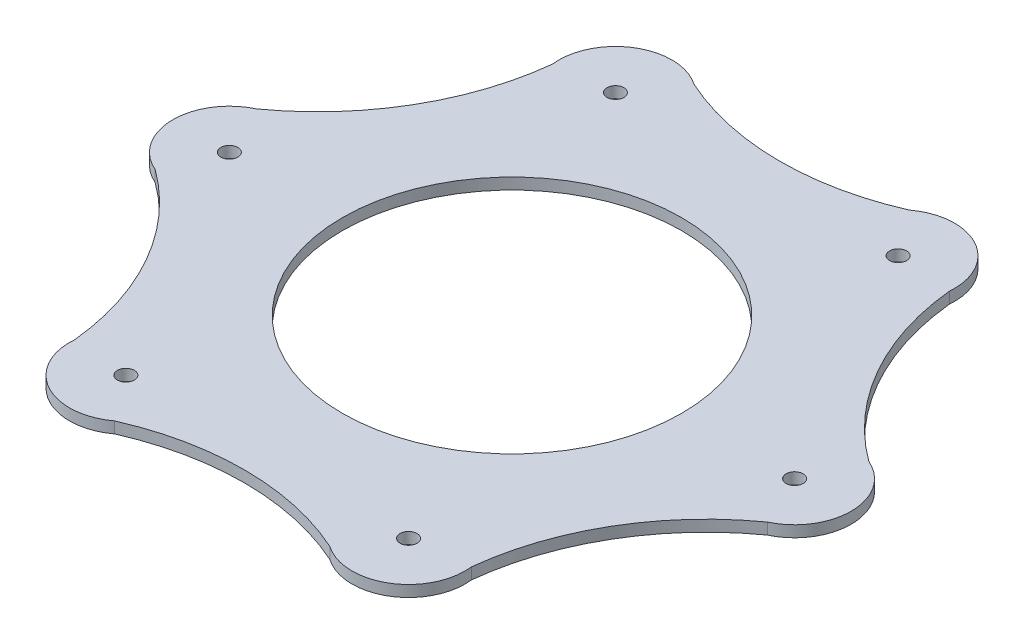
ISO-10303-21;
HEADER;
FILE_DESCRIPTION(('STEP AP214'),'2;1');
FILE_NAME('part.step','',(''),(''),'','','');
FILE_SCHEMA(('AUTOMOTIVE_DESIGN { 1 0 10303 214 1 1 1 1 }'));
ENDSEC;
DATA;
#1=APPLICATION_CONTEXT('core data for automotive mechanical design processes');
#2=APPLICATION_PROTOCOL_DEFINITION('international standard','automotive_design',2000,#1);
#3=PRODUCT_CONTEXT('',#1,'mechanical');
#4=PRODUCT('Part','Part','',(#3));
#5=PRODUCT_RELATED_PRODUCT_CATEGORY('part','',(#4));
#6=PRODUCT_DEFINITION_FORMATION('','',#4);
#7=PRODUCT_DEFINITION_CONTEXT('part definition',#1,'design');
#8=PRODUCT_DEFINITION('design','',#6,#7);
#9=PRODUCT_DEFINITION_SHAPE('','',#8);
#10=(LENGTH_UNIT() NAMED_UNIT(*) SI_UNIT(.MILLI.,.METRE.));
#11=(NAMED_UNIT(*) PLANE_ANGLE_UNIT() SI_UNIT($,.RADIAN.));
#12=(NAMED_UNIT(*) SI_UNIT($,.STERADIAN.) SOLID_ANGLE_UNIT());
#13=UNCERTAINTY_MEASURE_WITH_UNIT(LENGTH_MEASURE(1.E-05),#10,'distance_accuracy_value','');
#14=(GEOMETRIC_REPRESENTATION_CONTEXT(3) GLOBAL_UNCERTAINTY_ASSIGNED_CONTEXT((#13)) GLOBAL_UNIT_ASSIGNED_CONTEXT((#10,
#11,#12)) REPRESENTATION_CONTEXT('',''));
#15=CARTESIAN_POINT('',(0.,0.,0.));
#16=DIRECTION('',(0.,0.,1.));
#17=DIRECTION('',(1.,0.,0.));
#18=AXIS2_PLACEMENT_3D('',#15,#16,#17);
#19=CARTESIAN_POINT('',(-81.6104251950538,-1.99999999999999,47.0221208950114));
#20=DIRECTION('',(0.,1.,0.));
#21=DIRECTION('',(0.,0.,1.));
#22=AXIS2_PLACEMENT_3D('',#19,#20,#21);
#23=CYLINDRICAL_SURFACE('',#22,46.8718791369647);
#24=CARTESIAN_POINT('',(-81.6104251950538,0.,47.0221208950114));
#25=DIRECTION('',(0.,-1.,0.));
#26=DIRECTION('',(0.,0.,-1.));
#27=AXIS2_PLACEMENT_3D('',#24,#25,#26);
#28=CIRCLE('',#27,46.8718791369647);
#29=CARTESIAN_POINT('',(-53.9341237009031,0.,9.19362119656844));
#30=VERTEX_POINT('',#29);
#31=CARTESIAN_POINT('',(-34.9629411085947,0.,42.4411513214628));
#32=VERTEX_POINT('',#31);
#33=EDGE_CURVE('E166',#30,#32,#28,.T.);
#34=ORIENTED_EDGE('',*,*,#33,.F.);
#35=DIRECTION('',(0.,1.,0.));
#36=VECTOR('',#35,1.);
#37=CARTESIAN_POINT('',(-53.9341237009031,-1.99999999999999,9.19362119656844));
#38=LINE('',#37,#36);
#39=CARTESIAN_POINT('',(-53.9341237009031,-1.99999999999999,9.19362119656844));
#40=VERTEX_POINT('',#39);
#41=EDGE_CURVE('E11',#40,#30,#38,.T.);
#42=ORIENTED_EDGE('',*,*,#41,.F.);
#43=CARTESIAN_POINT('',(-81.6104251950538,-1.99999999999999,47.0221208950114));
#44=DIRECTION('',(0.,-1.,0.));
#45=DIRECTION('',(0.,0.,-1.));
#46=AXIS2_PLACEMENT_3D('',#43,#44,#45);
#47=CIRCLE('',#46,46.8718791369647);
#48=CARTESIAN_POINT('',(-34.9629411085947,-1.99999999999999,42.4411513214628));
#49=VERTEX_POINT('',#48);
#50=EDGE_CURVE('E211',#40,#49,#47,.T.);
#51=ORIENTED_EDGE('',*,*,#50,.T.);
#52=DIRECTION('',(0.,1.,0.));
#53=VECTOR('',#52,1.);
#54=CARTESIAN_POINT('',(-34.9629411085947,-1.99999999999999,42.4411513214628));
#55=LINE('',#54,#53);
#56=EDGE_CURVE('E42',#49,#32,#55,.T.);
#57=ORIENTED_EDGE('',*,*,#56,.T.);
#58=EDGE_LOOP('',(#34,#42,#51,#57));
#59=FACE_BOUND('',#58,.T.);
#60=ADVANCED_FACE('F39',(#59),#23,.F.);
#61=CARTESIAN_POINT('',(-50.,-1.99999999999999,0.));
#62=DIRECTION('',(0.,1.,0.));
#63=DIRECTION('',(0.,0.,1.));
#64=AXIS2_PLACEMENT_3D('',#61,#62,#63);
#65=CYLINDRICAL_SURFACE('',#64,10.);
#66=CARTESIAN_POINT('',(-50.,0.,0.));
#67=DIRECTION('',(0.,1.,0.));
#68=DIRECTION('',(0.,0.,1.));
#69=AXIS2_PLACEMENT_3D('',#66,#67,#68);
#70=CIRCLE('',#69,10.);
#71=CARTESIAN_POINT('',(-54.2365857645436,0.,-9.05821953033087));
#72=VERTEX_POINT('',#71);
#73=EDGE_CURVE('E208',#72,#30,#70,.T.);
#74=ORIENTED_EDGE('',*,*,#73,.F.);
#75=DIRECTION('',(0.,1.,0.));
#76=VECTOR('',#75,1.);
#77=CARTESIAN_POINT('',(-54.2365857645436,-1.99999999999999,-9.05821953033087));
#78=LINE('',#77,#76);
#79=CARTESIAN_POINT('',(-54.2365857645436,-1.99999999999999,-9.05821953033087));
#80=VERTEX_POINT('',#79);
#81=EDGE_CURVE('E49',#80,#72,#78,.T.);
#82=ORIENTED_EDGE('',*,*,#81,.F.);
#83=CARTESIAN_POINT('',(-50.,-1.99999999999999,0.));
#84=DIRECTION('',(0.,1.,0.));
#85=DIRECTION('',(0.,0.,1.));
#86=AXIS2_PLACEMENT_3D('',#83,#84,#85);
#87=CIRCLE('',#86,10.);
#88=EDGE_CURVE('E152',#80,#40,#87,.T.);
#89=ORIENTED_EDGE('',*,*,#88,.T.);
#90=ORIENTED_EDGE('',*,*,#41,.T.);
#91=EDGE_LOOP('',(#74,#82,#89,#90));
#92=FACE_BOUND('',#91,.T.);
#93=ADVANCED_FACE('F241',(#92),#65,.T.);
#94=CARTESIAN_POINT('',(-81.5275638324299,-1.99999999999999,-47.1656409850605));
#95=DIRECTION('',(0.,1.,0.));
#96=DIRECTION('',(0.,0.,1.));
#97=AXIS2_PLACEMENT_3D('',#94,#95,#96);
#98=CYLINDRICAL_SURFACE('',#97,46.8718791369648);
#99=CARTESIAN_POINT('',(-81.5275638324299,0.,-47.1656409850605));
#100=DIRECTION('',(0.,-1.,0.));
#101=DIRECTION('',(0.,0.,-1.));
#102=AXIS2_PLACEMENT_3D('',#99,#100,#101);
#103=CIRCLE('',#102,46.8718791369648);
#104=CARTESIAN_POINT('',(-34.9289713594509,0.,-42.1115106575502));
#105=VERTEX_POINT('',#104);
#106=EDGE_CURVE('E138',#105,#72,#103,.T.);
#107=ORIENTED_EDGE('',*,*,#106,.F.);
#108=DIRECTION('',(0.,1.,0.));
#109=VECTOR('',#108,1.);
#110=CARTESIAN_POINT('',(-34.9289713594509,-1.99999999999999,-42.1115106575502));
#111=LINE('',#110,#109);
#112=CARTESIAN_POINT('',(-34.9289713594509,-1.99999999999999,-42.1115106575502));
#113=VERTEX_POINT('',#112);
#114=EDGE_CURVE('E133',#113,#105,#111,.T.);
#115=ORIENTED_EDGE('',*,*,#114,.F.);
#116=CARTESIAN_POINT('',(-81.5275638324299,-1.99999999999999,-47.1656409850605));
#117=DIRECTION('',(0.,-1.,0.));
#118=DIRECTION('',(0.,0.,-1.));
#119=AXIS2_PLACEMENT_3D('',#116,#117,#118);
#120=CIRCLE('',#119,46.8718791369648);
#121=EDGE_CURVE('E136',#113,#80,#120,.T.);
#122=ORIENTED_EDGE('',*,*,#121,.T.);
#123=ORIENTED_EDGE('',*,*,#81,.T.);
#124=EDGE_LOOP('',(#107,#115,#122,#123));
#125=FACE_BOUND('',#124,.T.);
#126=ADVANCED_FACE('F135',(#125),#98,.F.);
#127=CARTESIAN_POINT('',(-25.,-1.99999999999999,-43.3012701892219));
#128=DIRECTION('',(0.,1.,0.));
#129=DIRECTION('',(0.,0.,1.));
#130=AXIS2_PLACEMENT_3D('',#127,#128,#129);
#131=CYLINDRICAL_SURFACE('',#130,10.);
#132=CARTESIAN_POINT('',(-25.,0.,-43.3012701892219));
#133=DIRECTION('',(0.,1.,0.));
#134=DIRECTION('',(0.,0.,1.));
#135=AXIS2_PLACEMENT_3D('',#132,#133,#134);
#136=CIRCLE('',#135,10.);
#137=CARTESIAN_POINT('',(-19.273644655949,0.,-51.4993708517937));
#138=VERTEX_POINT('',#137);
#139=EDGE_CURVE('E203',#138,#105,#136,.T.);
#140=ORIENTED_EDGE('',*,*,#139,.F.);
#141=DIRECTION('',(0.,1.,0.));
#142=VECTOR('',#141,1.);
#143=CARTESIAN_POINT('',(-19.273644655949,-1.99999999999999,-51.4993708517937));
#144=LINE('',#143,#142);
#145=CARTESIAN_POINT('',(-19.273644655949,-1.99999999999999,-51.4993708517937));
#146=VERTEX_POINT('',#145);
#147=EDGE_CURVE('E144',#146,#138,#144,.T.);
#148=ORIENTED_EDGE('',*,*,#147,.F.);
#149=CARTESIAN_POINT('',(-25.,-1.99999999999999,-43.3012701892219));
#150=DIRECTION('',(0.,1.,0.));
#151=DIRECTION('',(0.,0.,1.));
#152=AXIS2_PLACEMENT_3D('',#149,#150,#151);
#153=CIRCLE('',#152,10.);
#154=EDGE_CURVE('E150',#146,#113,#153,.T.);
#155=ORIENTED_EDGE('',*,*,#154,.T.);
#156=ORIENTED_EDGE('',*,*,#114,.T.);
#157=EDGE_LOOP('',(#140,#148,#155,#156));
#158=FACE_BOUND('',#157,.T.);
#159=ADVANCED_FACE('F155',(#158),#131,.T.);
#160=CARTESIAN_POINT('',(0.0828613626238912,-1.99999999999999,-94.1877618800719));
#161=DIRECTION('',(0.,1.,0.));
#162=DIRECTION('',(0.,0.,1.));
#163=AXIS2_PLACEMENT_3D('',#160,#161,#162);
#164=CYLINDRICAL_SURFACE('',#163,46.8718791369647);
#165=CARTESIAN_POINT('',(0.0828613626238912,0.,-94.1877618800719));
#166=DIRECTION('',(0.,-1.,0.));
#167=DIRECTION('',(0.,0.,-1.));
#168=AXIS2_PLACEMENT_3D('',#165,#166,#167);
#169=CIRCLE('',#168,46.8718791369647);
#170=CARTESIAN_POINT('',(19.0051523414522,0.,-51.3051318541187));
#171=VERTEX_POINT('',#170);
#172=EDGE_CURVE('E199',#171,#138,#169,.T.);
#173=ORIENTED_EDGE('',*,*,#172,.F.);
#174=DIRECTION('',(0.,1.,0.));
#175=VECTOR('',#174,1.);
#176=CARTESIAN_POINT('',(19.0051523414522,-1.99999999999999,-51.3051318541187));
#177=LINE('',#176,#175);
#178=CARTESIAN_POINT('',(19.0051523414522,-1.99999999999999,-51.3051318541187));
#179=VERTEX_POINT('',#178);
#180=EDGE_CURVE('E217',#179,#171,#177,.T.);
#181=ORIENTED_EDGE('',*,*,#180,.F.);
#182=CARTESIAN_POINT('',(0.0828613626238912,-1.99999999999999,-94.1877618800719));
#183=DIRECTION('',(0.,-1.,0.));
#184=DIRECTION('',(0.,0.,-1.));
#185=AXIS2_PLACEMENT_3D('',#182,#183,#184);
#186=CIRCLE('',#185,46.8718791369647);
#187=EDGE_CURVE('E157',#179,#146,#186,.T.);
#188=ORIENTED_EDGE('',*,*,#187,.T.);
#189=ORIENTED_EDGE('',*,*,#147,.T.);
#190=EDGE_LOOP('',(#173,#181,#188,#189));
#191=FACE_BOUND('',#190,.T.);
#192=ADVANCED_FACE('F254',(#191),#164,.F.);
#193=CARTESIAN_POINT('',(25.,-1.99999999999999,-43.3012701892219));
#194=DIRECTION('',(0.,1.,0.));
#195=DIRECTION('',(0.,0.,1.));
#196=AXIS2_PLACEMENT_3D('',#193,#194,#195);
#197=CYLINDRICAL_SURFACE('',#196,10.);
#198=CARTESIAN_POINT('',(25.,0.,-43.3012701892219));
#199=DIRECTION('',(0.,1.,0.));
#200=DIRECTION('',(0.,0.,1.));
#201=AXIS2_PLACEMENT_3D('',#198,#199,#200);
#202=CIRCLE('',#201,10.);
#203=CARTESIAN_POINT('',(34.9629411085947,0.,-42.4411513214628));
#204=VERTEX_POINT('',#203);
#205=EDGE_CURVE('E195',#204,#171,#202,.T.);
#206=ORIENTED_EDGE('',*,*,#205,.F.);
#207=DIRECTION('',(0.,1.,0.));
#208=VECTOR('',#207,1.);
#209=CARTESIAN_POINT('',(34.9629411085947,-1.99999999999999,-42.4411513214628));
#210=LINE('',#209,#208);
#211=CARTESIAN_POINT('',(34.9629411085947,-1.99999999999999,-42.4411513214628));
#212=VERTEX_POINT('',#211);
#213=EDGE_CURVE('E220',#212,#204,#210,.T.);
#214=ORIENTED_EDGE('',*,*,#213,.F.);
#215=CARTESIAN_POINT('',(25.,-1.99999999999999,-43.3012701892219));
#216=DIRECTION('',(0.,1.,0.));
#217=DIRECTION('',(0.,0.,1.));
#218=AXIS2_PLACEMENT_3D('',#215,#216,#217);
#219=CIRCLE('',#218,10.);
#220=EDGE_CURVE('E160',#212,#179,#219,.T.);
#221=ORIENTED_EDGE('',*,*,#220,.T.);
#222=ORIENTED_EDGE('',*,*,#180,.T.);
#223=EDGE_LOOP('',(#206,#214,#221,#222));
#224=FACE_BOUND('',#223,.T.);
#225=ADVANCED_FACE('F257',(#224),#197,.T.);
#226=CARTESIAN_POINT('',(81.6104251950538,-1.99999999999999,-47.0221208950115));
#227=DIRECTION('',(0.,1.,0.));
#228=DIRECTION('',(0.,0.,1.));
#229=AXIS2_PLACEMENT_3D('',#226,#227,#228);
#230=CYLINDRICAL_SURFACE('',#229,46.8718791369648);
#231=CARTESIAN_POINT('',(81.6104251950538,0.,-47.0221208950115));
#232=DIRECTION('',(0.,-1.,0.));
#233=DIRECTION('',(0.,0.,-1.));
#234=AXIS2_PLACEMENT_3D('',#231,#232,#233);
#235=CIRCLE('',#234,46.8718791369648);
#236=CARTESIAN_POINT('',(53.9341237009031,0.,-9.19362119656846));
#237=VERTEX_POINT('',#236);
#238=EDGE_CURVE('E191',#237,#204,#235,.T.);
#239=ORIENTED_EDGE('',*,*,#238,.F.);
#240=DIRECTION('',(0.,1.,0.));
#241=VECTOR('',#240,1.);
#242=CARTESIAN_POINT('',(53.9341237009031,-1.99999999999999,-9.19362119656846));
#243=LINE('',#242,#241);
#244=CARTESIAN_POINT('',(53.9341237009031,-1.99999999999999,-9.19362119656846));
#245=VERTEX_POINT('',#244);
#246=EDGE_CURVE('E223',#245,#237,#243,.T.);
#247=ORIENTED_EDGE('',*,*,#246,.F.);
#248=CARTESIAN_POINT('',(81.6104251950538,-1.99999999999999,-47.0221208950115));
#249=DIRECTION('',(0.,-1.,0.));
#250=DIRECTION('',(0.,0.,-1.));
#251=AXIS2_PLACEMENT_3D('',#248,#249,#250);
#252=CIRCLE('',#251,46.8718791369648);
#253=EDGE_CURVE('E401',#245,#212,#252,.T.);
#254=ORIENTED_EDGE('',*,*,#253,.T.);
#255=ORIENTED_EDGE('',*,*,#213,.T.);
#256=EDGE_LOOP('',(#239,#247,#254,#255));
#257=FACE_BOUND('',#256,.T.);
#258=ADVANCED_FACE('F261',(#257),#230,.F.);
#259=CARTESIAN_POINT('',(50.,-1.99999999999999,0.));
#260=DIRECTION('',(0.,1.,0.));
#261=DIRECTION('',(0.,0.,1.));
#262=AXIS2_PLACEMENT_3D('',#259,#260,#261);
#263=CYLINDRICAL_SURFACE('',#262,10.);
#264=CARTESIAN_POINT('',(50.,0.,0.));
#265=DIRECTION('',(0.,1.,0.));
#266=DIRECTION('',(0.,0.,1.));
#267=AXIS2_PLACEMENT_3D('',#264,#265,#266);
#268=CIRCLE('',#267,10.);
#269=CARTESIAN_POINT('',(54.2365857645437,0.,9.05821953033082));
#270=VERTEX_POINT('',#269);
#271=EDGE_CURVE('E187',#270,#237,#268,.T.);
#272=ORIENTED_EDGE('',*,*,#271,.F.);
#273=DIRECTION('',(0.,1.,0.));
#274=VECTOR('',#273,1.);
#275=CARTESIAN_POINT('',(54.2365857645437,-1.99999999999999,9.05821953033082));
#276=LINE('',#275,#274);
#277=CARTESIAN_POINT('',(54.2365857645437,-1.99999999999999,9.05821953033082));
#278=VERTEX_POINT('',#277);
#279=EDGE_CURVE('E226',#278,#270,#276,.T.);
#280=ORIENTED_EDGE('',*,*,#279,.F.);
#281=CARTESIAN_POINT('',(50.,-1.99999999999999,0.));
#282=DIRECTION('',(0.,1.,0.));
#283=DIRECTION('',(0.,0.,1.));
#284=AXIS2_PLACEMENT_3D('',#281,#282,#283);
#285=CIRCLE('',#284,10.);
#286=EDGE_CURVE('E397',#278,#245,#285,.T.);
#287=ORIENTED_EDGE('',*,*,#286,.T.);
#288=ORIENTED_EDGE('',*,*,#246,.T.);
#289=EDGE_LOOP('',(#272,#280,#287,#288));
#290=FACE_BOUND('',#289,.T.);
#291=ADVANCED_FACE('F265',(#290),#263,.T.);
#292=CARTESIAN_POINT('',(81.5275638324299,-1.99999999999999,47.1656409850604));
#293=DIRECTION('',(0.,1.,0.));
#294=DIRECTION('',(0.,0.,1.));
#295=AXIS2_PLACEMENT_3D('',#292,#293,#294);
#296=CYLINDRICAL_SURFACE('',#295,46.8718791369648);
#297=CARTESIAN_POINT('',(81.5275638324299,0.,47.1656409850604));
#298=DIRECTION('',(0.,-1.,0.));
#299=DIRECTION('',(0.,0.,-1.));
#300=AXIS2_PLACEMENT_3D('',#297,#298,#299);
#301=CIRCLE('',#300,46.8718791369648);
#302=CARTESIAN_POINT('',(34.9289713594509,0.,42.1115106575502));
#303=VERTEX_POINT('',#302);
#304=EDGE_CURVE('E183',#303,#270,#301,.T.);
#305=ORIENTED_EDGE('',*,*,#304,.F.);
#306=DIRECTION('',(0.,1.,0.));
#307=VECTOR('',#306,1.);
#308=CARTESIAN_POINT('',(34.9289713594509,-1.99999999999999,42.1115106575502));
#309=LINE('',#308,#307);
#310=CARTESIAN_POINT('',(34.9289713594509,-1.99999999999999,42.1115106575502));
#311=VERTEX_POINT('',#310);
#312=EDGE_CURVE('E229',#311,#303,#309,.T.);
#313=ORIENTED_EDGE('',*,*,#312,.F.);
#314=CARTESIAN_POINT('',(81.5275638324299,-1.99999999999999,47.1656409850604));
#315=DIRECTION('',(0.,-1.,0.));
#316=DIRECTION('',(0.,0.,-1.));
#317=AXIS2_PLACEMENT_3D('',#314,#315,#316);
#318=CIRCLE('',#317,46.8718791369648);
#319=EDGE_CURVE('E393',#311,#278,#318,.T.);
#320=ORIENTED_EDGE('',*,*,#319,.T.);
#321=ORIENTED_EDGE('',*,*,#279,.T.);
#322=EDGE_LOOP('',(#305,#313,#320,#321));
#323=FACE_BOUND('',#322,.T.);
#324=ADVANCED_FACE('F269',(#323),#296,.F.);
#325=CARTESIAN_POINT('',(25.,-1.99999999999999,43.301270189222));
#326=DIRECTION('',(0.,1.,0.));
#327=DIRECTION('',(0.,0.,1.));
#328=AXIS2_PLACEMENT_3D('',#325,#326,#327);
#329=CYLINDRICAL_SURFACE('',#328,10.);
#330=CARTESIAN_POINT('',(25.,0.,43.301270189222));
#331=DIRECTION('',(0.,1.,0.));
#332=DIRECTION('',(0.,0.,1.));
#333=AXIS2_PLACEMENT_3D('',#330,#331,#332);
#334=CIRCLE('',#333,10.);
#335=CARTESIAN_POINT('',(19.273644655949,0.,51.4993708517937));
#336=VERTEX_POINT('',#335);
#337=EDGE_CURVE('E179',#336,#303,#334,.T.);
#338=ORIENTED_EDGE('',*,*,#337,.F.);
#339=DIRECTION('',(0.,1.,0.));
#340=VECTOR('',#339,1.);
#341=CARTESIAN_POINT('',(19.273644655949,-1.99999999999999,51.4993708517937));
#342=LINE('',#341,#340);
#343=CARTESIAN_POINT('',(19.273644655949,-1.99999999999999,51.4993708517937));
#344=VERTEX_POINT('',#343);
#345=EDGE_CURVE('E232',#344,#336,#342,.T.);
#346=ORIENTED_EDGE('',*,*,#345,.F.);
#347=CARTESIAN_POINT('',(25.,-1.99999999999999,43.301270189222));
#348=DIRECTION('',(0.,1.,0.));
#349=DIRECTION('',(0.,0.,1.));
#350=AXIS2_PLACEMENT_3D('',#347,#348,#349);
#351=CIRCLE('',#350,10.);
#352=EDGE_CURVE('E389',#344,#311,#351,.T.);
#353=ORIENTED_EDGE('',*,*,#352,.T.);
#354=ORIENTED_EDGE('',*,*,#312,.T.);
#355=EDGE_LOOP('',(#338,#346,#353,#354));
#356=FACE_BOUND('',#355,.T.);
#357=ADVANCED_FACE('F273',(#356),#329,.T.);
#358=CARTESIAN_POINT('',(-0.0828613626238797,-1.99999999999999,94.1877618800719));
#359=DIRECTION('',(0.,1.,0.));
#360=DIRECTION('',(0.,0.,1.));
#361=AXIS2_PLACEMENT_3D('',#358,#359,#360);
#362=CYLINDRICAL_SURFACE('',#361,46.8718791369647);
#363=CARTESIAN_POINT('',(-0.0828613626238797,0.,94.1877618800719));
#364=DIRECTION('',(0.,-1.,0.));
#365=DIRECTION('',(0.,0.,-1.));
#366=AXIS2_PLACEMENT_3D('',#363,#364,#365);
#367=CIRCLE('',#366,46.8718791369647);
#368=CARTESIAN_POINT('',(-19.0051523414522,0.,51.3051318541187));
#369=VERTEX_POINT('',#368);
#370=EDGE_CURVE('E175',#369,#336,#367,.T.);
#371=ORIENTED_EDGE('',*,*,#370,.F.);
#372=DIRECTION('',(0.,1.,0.));
#373=VECTOR('',#372,1.);
#374=CARTESIAN_POINT('',(-19.0051523414522,-1.99999999999999,51.3051318541187));
#375=LINE('',#374,#373);
#376=CARTESIAN_POINT('',(-19.0051523414522,-1.99999999999999,51.3051318541187));
#377=VERTEX_POINT('',#376);
#378=EDGE_CURVE('E234',#377,#369,#375,.T.);
#379=ORIENTED_EDGE('',*,*,#378,.F.);
#380=CARTESIAN_POINT('',(-0.0828613626238797,-1.99999999999999,94.1877618800719));
#381=DIRECTION('',(0.,-1.,0.));
#382=DIRECTION('',(0.,0.,-1.));
#383=AXIS2_PLACEMENT_3D('',#380,#381,#382);
#384=CIRCLE('',#383,46.8718791369647);
#385=EDGE_CURVE('E385',#377,#344,#384,.T.);
#386=ORIENTED_EDGE('',*,*,#385,.T.);
#387=ORIENTED_EDGE('',*,*,#345,.T.);
#388=EDGE_LOOP('',(#371,#379,#386,#387));
#389=FACE_BOUND('',#388,.T.);
#390=ADVANCED_FACE('F277',(#389),#362,.F.);
#391=CARTESIAN_POINT('',(-25.,-1.99999999999999,43.3012701892219));
#392=DIRECTION('',(0.,1.,0.));
#393=DIRECTION('',(0.,0.,1.));
#394=AXIS2_PLACEMENT_3D('',#391,#392,#393);
#395=CYLINDRICAL_SURFACE('',#394,10.);
#396=CARTESIAN_POINT('',(-25.,0.,43.3012701892219));
#397=DIRECTION('',(0.,1.,0.));
#398=DIRECTION('',(0.,0.,1.));
#399=AXIS2_PLACEMENT_3D('',#396,#397,#398);
#400=CIRCLE('',#399,10.);
#401=EDGE_CURVE('E170',#32,#369,#400,.T.);
#402=ORIENTED_EDGE('',*,*,#401,.F.);
#403=ORIENTED_EDGE('',*,*,#56,.F.);
#404=CARTESIAN_POINT('',(-25.,-1.99999999999999,43.3012701892219));
#405=DIRECTION('',(0.,1.,0.));
#406=DIRECTION('',(0.,0.,1.));
#407=AXIS2_PLACEMENT_3D('',#404,#405,#406);
#408=CIRCLE('',#407,10.);
#409=EDGE_CURVE('E382',#49,#377,#408,.T.);
#410=ORIENTED_EDGE('',*,*,#409,.T.);
#411=ORIENTED_EDGE('',*,*,#378,.T.);
#412=EDGE_LOOP('',(#402,#403,#410,#411));
#413=FACE_BOUND('',#412,.T.);
#414=ADVANCED_FACE('F238',(#413),#395,.T.);
#415=CARTESIAN_POINT('',(-53.3052125975269,-1.99999999999999,45.1616955421166));
#416=DIRECTION('',(0.,-1.,0.));
#417=DIRECTION('',(0.,0.,-1.));
#418=AXIS2_PLACEMENT_3D('',#415,#416,#417);
#419=PLANE('',#418);
#420=CARTESIAN_POINT('',(-25.,-1.99999999999999,-43.3012701892219));
#421=DIRECTION('',(0.,1.,0.));
#422=DIRECTION('',(0.,0.,-1.));
#423=AXIS2_PLACEMENT_3D('',#420,#421,#422);
#424=CIRCLE('',#423,1.5);
#425=CARTESIAN_POINT('',(-25.,-1.99999999999999,-44.8012701892219));
#426=VERTEX_POINT('',#425);
#427=EDGE_CURVE('E324',#426,#426,#424,.T.);
#428=ORIENTED_EDGE('',*,*,#427,.T.);
#429=EDGE_LOOP('',(#428));
#430=FACE_BOUND('',#429,.T.);
#431=CARTESIAN_POINT('',(-50.,-1.99999999999999,0.));
#432=DIRECTION('',(0.,1.,0.));
#433=DIRECTION('',(0.,0.,-1.));
#434=AXIS2_PLACEMENT_3D('',#431,#432,#433);
#435=CIRCLE('',#434,1.5);
#436=CARTESIAN_POINT('',(-50.,-1.99999999999999,-1.50000000000001));
#437=VERTEX_POINT('',#436);
#438=EDGE_CURVE('E334',#437,#437,#435,.T.);
#439=ORIENTED_EDGE('',*,*,#438,.T.);
#440=EDGE_LOOP('',(#439));
#441=FACE_BOUND('',#440,.T.);
#442=CARTESIAN_POINT('',(-25.,-1.99999999999999,43.3012701892219));
#443=DIRECTION('',(0.,1.,0.));
#444=DIRECTION('',(0.,0.,-1.));
#445=AXIS2_PLACEMENT_3D('',#442,#443,#444);
#446=CIRCLE('',#445,1.5);
#447=CARTESIAN_POINT('',(-25.,-1.99999999999999,41.8012701892219));
#448=VERTEX_POINT('',#447);
#449=EDGE_CURVE('E342',#448,#448,#446,.T.);
#450=ORIENTED_EDGE('',*,*,#449,.T.);
#451=EDGE_LOOP('',(#450));
#452=FACE_BOUND('',#451,.T.);
#453=CARTESIAN_POINT('',(25.,-1.99999999999999,-43.3012701892219));
#454=DIRECTION('',(0.,1.,0.));
#455=DIRECTION('',(0.,0.,-1.));
#456=AXIS2_PLACEMENT_3D('',#453,#454,#455);
#457=CIRCLE('',#456,1.5);
#458=CARTESIAN_POINT('',(25.,-1.99999999999999,-44.8012701892219));
#459=VERTEX_POINT('',#458);
#460=EDGE_CURVE('E350',#459,#459,#457,.T.);
#461=ORIENTED_EDGE('',*,*,#460,.T.);
#462=EDGE_LOOP('',(#461));
#463=FACE_BOUND('',#462,.T.);
#464=CARTESIAN_POINT('',(25.,-1.99999999999999,43.301270189222));
#465=DIRECTION('',(0.,1.,0.));
#466=DIRECTION('',(0.,0.,-1.));
#467=AXIS2_PLACEMENT_3D('',#464,#465,#466);
#468=CIRCLE('',#467,1.5);
#469=CARTESIAN_POINT('',(25.,-1.99999999999999,41.801270189222));
#470=VERTEX_POINT('',#469);
#471=EDGE_CURVE('E358',#470,#470,#468,.T.);
#472=ORIENTED_EDGE('',*,*,#471,.T.);
#473=EDGE_LOOP('',(#472));
#474=FACE_BOUND('',#473,.T.);
#475=CARTESIAN_POINT('',(50.,-1.99999999999999,0.));
#476=DIRECTION('',(0.,1.,0.));
#477=DIRECTION('',(0.,0.,-1.));
#478=AXIS2_PLACEMENT_3D('',#475,#476,#477);
#479=CIRCLE('',#478,1.5);
#480=CARTESIAN_POINT('',(50.,-1.99999999999999,-1.5));
#481=VERTEX_POINT('',#480);
#482=EDGE_CURVE('E366',#481,#481,#479,.T.);
#483=ORIENTED_EDGE('',*,*,#482,.T.);
#484=EDGE_LOOP('',(#483));
#485=FACE_BOUND('',#484,.T.);
#486=CARTESIAN_POINT('',(0.,-1.99999999999999,0.));
#487=DIRECTION('',(0.,1.,0.));
#488=DIRECTION('',(0.,0.,-1.));
#489=AXIS2_PLACEMENT_3D('',#486,#487,#488);
#490=CIRCLE('',#489,30.);
#491=CARTESIAN_POINT('',(0.,-1.99999999999999,-30.));
#492=VERTEX_POINT('',#491);
#493=EDGE_CURVE('E171',#492,#492,#490,.T.);
#494=ORIENTED_EDGE('',*,*,#493,.T.);
#495=EDGE_LOOP('',(#494));
#496=FACE_BOUND('',#495,.T.);
#497=ORIENTED_EDGE('',*,*,#50,.F.);
#498=ORIENTED_EDGE('',*,*,#88,.F.);
#499=ORIENTED_EDGE('',*,*,#121,.F.);
#500=ORIENTED_EDGE('',*,*,#154,.F.);
#501=ORIENTED_EDGE('',*,*,#187,.F.);
#502=ORIENTED_EDGE('',*,*,#220,.F.);
#503=ORIENTED_EDGE('',*,*,#253,.F.);
#504=ORIENTED_EDGE('',*,*,#286,.F.);
#505=ORIENTED_EDGE('',*,*,#319,.F.);
#506=ORIENTED_EDGE('',*,*,#352,.F.);
#507=ORIENTED_EDGE('',*,*,#385,.F.);
#508=ORIENTED_EDGE('',*,*,#409,.F.);
#509=EDGE_LOOP('',(#497,#498,#499,#500,#501,#502,#503,#504,#505,#506,#507,#508));
#510=FACE_BOUND('',#509,.T.);
#511=ADVANCED_FACE('F148',(#430,#441,#452,#463,#474,#485,#496,#510),#419,.T.);
#512=CARTESIAN_POINT('',(-53.3052125975269,0.,45.1616955421166));
#513=DIRECTION('',(0.,-1.,0.));
#514=DIRECTION('',(0.,0.,-1.));
#515=AXIS2_PLACEMENT_3D('',#512,#513,#514);
#516=PLANE('',#515);
#517=CARTESIAN_POINT('',(-25.,0.,-43.3012701892219));
#518=DIRECTION('',(0.,1.,0.));
#519=DIRECTION('',(0.,0.,-1.));
#520=AXIS2_PLACEMENT_3D('',#517,#518,#519);
#521=CIRCLE('',#520,1.5);
#522=CARTESIAN_POINT('',(-25.,0.,-44.8012701892219));
#523=VERTEX_POINT('',#522);
#524=EDGE_CURVE('E327',#523,#523,#521,.T.);
#525=ORIENTED_EDGE('',*,*,#524,.F.);
#526=EDGE_LOOP('',(#525));
#527=FACE_BOUND('',#526,.T.);
#528=CARTESIAN_POINT('',(-50.,0.,0.));
#529=DIRECTION('',(0.,1.,0.));
#530=DIRECTION('',(0.,0.,-1.));
#531=AXIS2_PLACEMENT_3D('',#528,#529,#530);
#532=CIRCLE('',#531,1.5);
#533=CARTESIAN_POINT('',(-50.,0.,-1.50000000000001));
#534=VERTEX_POINT('',#533);
#535=EDGE_CURVE('E331',#534,#534,#532,.T.);
#536=ORIENTED_EDGE('',*,*,#535,.F.);
#537=EDGE_LOOP('',(#536));
#538=FACE_BOUND('',#537,.T.);
#539=CARTESIAN_POINT('',(-25.,0.,43.3012701892219));
#540=DIRECTION('',(0.,1.,0.));
#541=DIRECTION('',(0.,0.,-1.));
#542=AXIS2_PLACEMENT_3D('',#539,#540,#541);
#543=CIRCLE('',#542,1.5);
#544=CARTESIAN_POINT('',(-25.,0.,41.8012701892219));
#545=VERTEX_POINT('',#544);
#546=EDGE_CURVE('E338',#545,#545,#543,.T.);
#547=ORIENTED_EDGE('',*,*,#546,.F.);
#548=EDGE_LOOP('',(#547));
#549=FACE_BOUND('',#548,.T.);
#550=CARTESIAN_POINT('',(25.,0.,-43.3012701892219));
#551=DIRECTION('',(0.,1.,0.));
#552=DIRECTION('',(0.,0.,-1.));
#553=AXIS2_PLACEMENT_3D('',#550,#551,#552);
#554=CIRCLE('',#553,1.5);
#555=CARTESIAN_POINT('',(25.,0.,-44.8012701892219));
#556=VERTEX_POINT('',#555);
#557=EDGE_CURVE('E346',#556,#556,#554,.T.);
#558=ORIENTED_EDGE('',*,*,#557,.F.);
#559=EDGE_LOOP('',(#558));
#560=FACE_BOUND('',#559,.T.);
#561=CARTESIAN_POINT('',(25.,0.,43.301270189222));
#562=DIRECTION('',(0.,1.,0.));
#563=DIRECTION('',(0.,0.,-1.));
#564=AXIS2_PLACEMENT_3D('',#561,#562,#563);
#565=CIRCLE('',#564,1.5);
#566=CARTESIAN_POINT('',(25.,0.,41.801270189222));
#567=VERTEX_POINT('',#566);
#568=EDGE_CURVE('E354',#567,#567,#565,.T.);
#569=ORIENTED_EDGE('',*,*,#568,.F.);
#570=EDGE_LOOP('',(#569));
#571=FACE_BOUND('',#570,.T.);
#572=CARTESIAN_POINT('',(50.,0.,0.));
#573=DIRECTION('',(0.,1.,0.));
#574=DIRECTION('',(0.,0.,-1.));
#575=AXIS2_PLACEMENT_3D('',#572,#573,#574);
#576=CIRCLE('',#575,1.5);
#577=CARTESIAN_POINT('',(50.,0.,-1.5));
#578=VERTEX_POINT('',#577);
#579=EDGE_CURVE('E362',#578,#578,#576,.T.);
#580=ORIENTED_EDGE('',*,*,#579,.F.);
#581=EDGE_LOOP('',(#580));
#582=FACE_BOUND('',#581,.T.);
#583=CARTESIAN_POINT('',(0.,0.,0.));
#584=DIRECTION('',(0.,1.,0.));
#585=DIRECTION('',(0.,0.,-1.));
#586=AXIS2_PLACEMENT_3D('',#583,#584,#585);
#587=CIRCLE('',#586,30.);
#588=CARTESIAN_POINT('',(0.,0.,-30.));
#589=VERTEX_POINT('',#588);
#590=EDGE_CURVE('E370',#589,#589,#587,.T.);
#591=ORIENTED_EDGE('',*,*,#590,.F.);
#592=EDGE_LOOP('',(#591));
#593=FACE_BOUND('',#592,.T.);
#594=ORIENTED_EDGE('',*,*,#33,.T.);
#595=ORIENTED_EDGE('',*,*,#401,.T.);
#596=ORIENTED_EDGE('',*,*,#370,.T.);
#597=ORIENTED_EDGE('',*,*,#337,.T.);
#598=ORIENTED_EDGE('',*,*,#304,.T.);
#599=ORIENTED_EDGE('',*,*,#271,.T.);
#600=ORIENTED_EDGE('',*,*,#238,.T.);
#601=ORIENTED_EDGE('',*,*,#205,.T.);
#602=ORIENTED_EDGE('',*,*,#172,.T.);
#603=ORIENTED_EDGE('',*,*,#139,.T.);
#604=ORIENTED_EDGE('',*,*,#106,.T.);
#605=ORIENTED_EDGE('',*,*,#73,.T.);
#606=EDGE_LOOP('',(#594,#595,#596,#597,#598,#599,#600,#601,#602,#603,#604,#605));
#607=FACE_BOUND('',#606,.T.);
#608=ADVANCED_FACE('F240',(#527,#538,#549,#560,#571,#582,#593,#607),#516,.F.);
#609=CARTESIAN_POINT('',(0.,-1.99999999999999,0.));
#610=DIRECTION('',(0.,1.,0.));
#611=DIRECTION('',(0.,0.,1.));
#612=AXIS2_PLACEMENT_3D('',#609,#610,#611);
#613=CYLINDRICAL_SURFACE('',#612,30.);
#614=ORIENTED_EDGE('',*,*,#493,.F.);
#615=EDGE_LOOP('',(#614));
#616=FACE_BOUND('',#615,.T.);
#617=ORIENTED_EDGE('',*,*,#590,.T.);
#618=EDGE_LOOP('',(#617));
#619=FACE_BOUND('',#618,.T.);
#620=ADVANCED_FACE('F289',(#616,#619),#613,.F.);
#621=CARTESIAN_POINT('',(50.,-1.99999999999999,0.));
#622=DIRECTION('',(0.,1.,0.));
#623=DIRECTION('',(0.,0.,1.));
#624=AXIS2_PLACEMENT_3D('',#621,#622,#623);
#625=CYLINDRICAL_SURFACE('',#624,1.5);
#626=ORIENTED_EDGE('',*,*,#482,.F.);
#627=EDGE_LOOP('',(#626));
#628=FACE_BOUND('',#627,.T.);
#629=ORIENTED_EDGE('',*,*,#579,.T.);
#630=EDGE_LOOP('',(#629));
#631=FACE_BOUND('',#630,.T.);
#632=ADVANCED_FACE('F296',(#628,#631),#625,.F.);
#633=CARTESIAN_POINT('',(25.,-1.99999999999999,43.301270189222));
#634=DIRECTION('',(0.,1.,0.));
#635=DIRECTION('',(0.,0.,1.));
#636=AXIS2_PLACEMENT_3D('',#633,#634,#635);
#637=CYLINDRICAL_SURFACE('',#636,1.5);
#638=ORIENTED_EDGE('',*,*,#471,.F.);
#639=EDGE_LOOP('',(#638));
#640=FACE_BOUND('',#639,.T.);
#641=ORIENTED_EDGE('',*,*,#568,.T.);
#642=EDGE_LOOP('',(#641));
#643=FACE_BOUND('',#642,.T.);
#644=ADVANCED_FACE('F300',(#640,#643),#637,.F.);
#645=CARTESIAN_POINT('',(25.,-1.99999999999999,-43.3012701892219));
#646=DIRECTION('',(0.,1.,0.));
#647=DIRECTION('',(0.,0.,1.));
#648=AXIS2_PLACEMENT_3D('',#645,#646,#647);
#649=CYLINDRICAL_SURFACE('',#648,1.5);
#650=ORIENTED_EDGE('',*,*,#460,.F.);
#651=EDGE_LOOP('',(#650));
#652=FACE_BOUND('',#651,.T.);
#653=ORIENTED_EDGE('',*,*,#557,.T.);
#654=EDGE_LOOP('',(#653));
#655=FACE_BOUND('',#654,.T.);
#656=ADVANCED_FACE('F304',(#652,#655),#649,.F.);
#657=CARTESIAN_POINT('',(-25.,-1.99999999999999,43.3012701892219));
#658=DIRECTION('',(0.,1.,0.));
#659=DIRECTION('',(0.,0.,1.));
#660=AXIS2_PLACEMENT_3D('',#657,#658,#659);
#661=CYLINDRICAL_SURFACE('',#660,1.5);
#662=ORIENTED_EDGE('',*,*,#449,.F.);
#663=EDGE_LOOP('',(#662));
#664=FACE_BOUND('',#663,.T.);
#665=ORIENTED_EDGE('',*,*,#546,.T.);
#666=EDGE_LOOP('',(#665));
#667=FACE_BOUND('',#666,.T.);
#668=ADVANCED_FACE('F308',(#664,#667),#661,.F.);
#669=CARTESIAN_POINT('',(-50.,-1.99999999999999,0.));
#670=DIRECTION('',(0.,1.,0.));
#671=DIRECTION('',(0.,0.,1.));
#672=AXIS2_PLACEMENT_3D('',#669,#670,#671);
#673=CYLINDRICAL_SURFACE('',#672,1.5);
#674=ORIENTED_EDGE('',*,*,#438,.F.);
#675=EDGE_LOOP('',(#674));
#676=FACE_BOUND('',#675,.T.);
#677=ORIENTED_EDGE('',*,*,#535,.T.);
#678=EDGE_LOOP('',(#677));
#679=FACE_BOUND('',#678,.T.);
#680=ADVANCED_FACE('F312',(#676,#679),#673,.F.);
#681=CARTESIAN_POINT('',(-25.,-1.99999999999999,-43.3012701892219));
#682=DIRECTION('',(0.,1.,0.));
#683=DIRECTION('',(0.,0.,1.));
#684=AXIS2_PLACEMENT_3D('',#681,#682,#683);
#685=CYLINDRICAL_SURFACE('',#684,1.5);
#686=ORIENTED_EDGE('',*,*,#427,.F.);
#687=EDGE_LOOP('',(#686));
#688=FACE_BOUND('',#687,.T.);
#689=ORIENTED_EDGE('',*,*,#524,.T.);
#690=EDGE_LOOP('',(#689));
#691=FACE_BOUND('',#690,.T.);
#692=ADVANCED_FACE('F316',(#688,#691),#685,.F.);
#693=CLOSED_SHELL('',(#60,#93,#126,#159,#192,#225,#258,#291,#324,#357,#390,#414,#511,#608,#620,
#632,#644,#656,#668,#680,#692));
#694=MANIFOLD_SOLID_BREP('B2',#693);
#695=ADVANCED_BREP_SHAPE_REPRESENTATION('',(#18,#694),#14);
#696=SHAPE_DEFINITION_REPRESENTATION(#9,#695);
ENDSEC;
END-ISO-10303-21;
